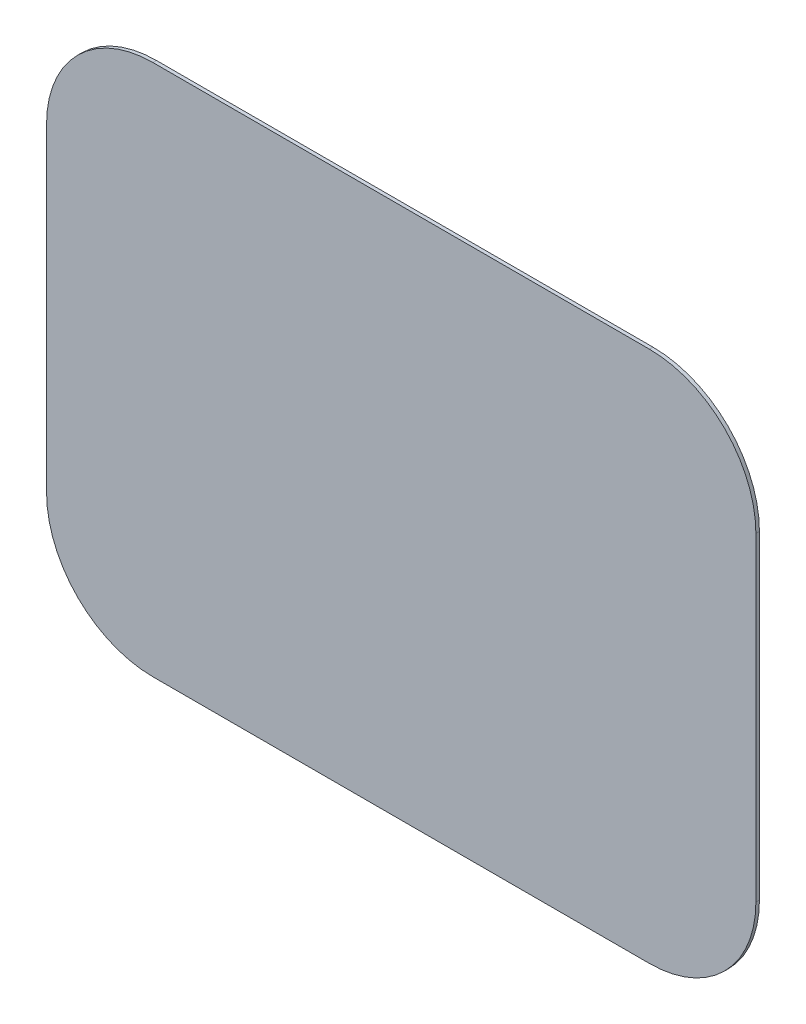
ISO-10303-21;
HEADER;
FILE_DESCRIPTION(('STEP AP214'),'2;1');
FILE_NAME('part.step','',(''),(''),'','','');
FILE_SCHEMA(('AUTOMOTIVE_DESIGN { 1 0 10303 214 1 1 1 1 }'));
ENDSEC;
DATA;
#1=APPLICATION_CONTEXT('core data for automotive mechanical design processes');
#2=APPLICATION_PROTOCOL_DEFINITION('international standard','automotive_design',2000,#1);
#3=PRODUCT_CONTEXT('',#1,'mechanical');
#4=PRODUCT('Part','Part','',(#3));
#5=PRODUCT_RELATED_PRODUCT_CATEGORY('part','',(#4));
#6=PRODUCT_DEFINITION_FORMATION('','',#4);
#7=PRODUCT_DEFINITION_CONTEXT('part definition',#1,'design');
#8=PRODUCT_DEFINITION('design','',#6,#7);
#9=PRODUCT_DEFINITION_SHAPE('','',#8);
#10=(LENGTH_UNIT() NAMED_UNIT(*) SI_UNIT(.MILLI.,.METRE.));
#11=(NAMED_UNIT(*) PLANE_ANGLE_UNIT() SI_UNIT($,.RADIAN.));
#12=(NAMED_UNIT(*) SI_UNIT($,.STERADIAN.) SOLID_ANGLE_UNIT());
#13=UNCERTAINTY_MEASURE_WITH_UNIT(LENGTH_MEASURE(1.E-05),#10,'distance_accuracy_value','');
#14=(GEOMETRIC_REPRESENTATION_CONTEXT(3) GLOBAL_UNCERTAINTY_ASSIGNED_CONTEXT((#13)) GLOBAL_UNIT_ASSIGNED_CONTEXT((#10,
#11,#12)) REPRESENTATION_CONTEXT('',''));
#15=CARTESIAN_POINT('',(0.,0.,0.));
#16=DIRECTION('',(0.,0.,1.));
#17=DIRECTION('',(1.,0.,0.));
#18=AXIS2_PLACEMENT_3D('',#15,#16,#17);
#19=CARTESIAN_POINT('',(-8.89,-5.715,0.126999999999988));
#20=DIRECTION('',(0.,0.,-1.));
#21=DIRECTION('',(-1.,0.,0.));
#22=AXIS2_PLACEMENT_3D('',#19,#20,#21);
#23=PLANE('',#22);
#24=CARTESIAN_POINT('',(8.89,-5.715,0.126999999999988));
#25=DIRECTION('',(0.,0.,-1.));
#26=DIRECTION('',(-1.,0.,0.));
#27=AXIS2_PLACEMENT_3D('',#24,#25,#26);
#28=CIRCLE('',#27,3.81);
#29=CARTESIAN_POINT('',(12.7,-5.715,0.126999999999988));
#30=VERTEX_POINT('',#29);
#31=CARTESIAN_POINT('',(8.89,-9.525,0.126999999999988));
#32=VERTEX_POINT('',#31);
#33=EDGE_CURVE('E20',#30,#32,#28,.T.);
#34=ORIENTED_EDGE('',*,*,#33,.F.);
#35=DIRECTION('',(0.,1.,0.));
#36=VECTOR('',#35,1.);
#37=CARTESIAN_POINT('',(12.7,-5.715,0.126999999999988));
#38=LINE('',#37,#36);
#39=CARTESIAN_POINT('',(12.7,5.715,0.126999999999988));
#40=VERTEX_POINT('',#39);
#41=EDGE_CURVE('E84',#30,#40,#38,.T.);
#42=ORIENTED_EDGE('',*,*,#41,.T.);
#43=CARTESIAN_POINT('',(8.89,5.715,0.126999999999988));
#44=DIRECTION('',(0.,0.,-1.));
#45=DIRECTION('',(-1.,0.,0.));
#46=AXIS2_PLACEMENT_3D('',#43,#44,#45);
#47=CIRCLE('',#46,3.81);
#48=CARTESIAN_POINT('',(8.89,9.525,0.126999999999988));
#49=VERTEX_POINT('',#48);
#50=EDGE_CURVE('E127',#49,#40,#47,.T.);
#51=ORIENTED_EDGE('',*,*,#50,.F.);
#52=DIRECTION('',(1.,0.,0.));
#53=VECTOR('',#52,1.);
#54=CARTESIAN_POINT('',(-8.89,9.525,0.126999999999988));
#55=LINE('',#54,#53);
#56=CARTESIAN_POINT('',(-8.89,9.525,0.126999999999988));
#57=VERTEX_POINT('',#56);
#58=EDGE_CURVE('E104',#49,#57,#55,.F.);
#59=ORIENTED_EDGE('',*,*,#58,.T.);
#60=CARTESIAN_POINT('',(-8.89,5.715,0.126999999999988));
#61=DIRECTION('',(0.,0.,-1.));
#62=DIRECTION('',(-1.,0.,0.));
#63=AXIS2_PLACEMENT_3D('',#60,#61,#62);
#64=CIRCLE('',#63,3.81);
#65=CARTESIAN_POINT('',(-12.7,5.715,0.126999999999988));
#66=VERTEX_POINT('',#65);
#67=EDGE_CURVE('E129',#66,#57,#64,.T.);
#68=ORIENTED_EDGE('',*,*,#67,.F.);
#69=DIRECTION('',(0.,1.,0.));
#70=VECTOR('',#69,1.);
#71=CARTESIAN_POINT('',(-12.7,-5.715,0.126999999999988));
#72=LINE('',#71,#70);
#73=CARTESIAN_POINT('',(-12.7,-5.715,0.126999999999988));
#74=VERTEX_POINT('',#73);
#75=EDGE_CURVE('E108',#66,#74,#72,.F.);
#76=ORIENTED_EDGE('',*,*,#75,.T.);
#77=CARTESIAN_POINT('',(-8.89,-5.715,0.126999999999988));
#78=DIRECTION('',(0.,0.,-1.));
#79=DIRECTION('',(-1.,0.,0.));
#80=AXIS2_PLACEMENT_3D('',#77,#78,#79);
#81=CIRCLE('',#80,3.81);
#82=CARTESIAN_POINT('',(-8.89,-9.525,0.126999999999988));
#83=VERTEX_POINT('',#82);
#84=EDGE_CURVE('E131',#83,#74,#81,.T.);
#85=ORIENTED_EDGE('',*,*,#84,.F.);
#86=DIRECTION('',(-1.,0.,0.));
#87=VECTOR('',#86,1.);
#88=CARTESIAN_POINT('',(-8.89,-9.525,0.126999999999988));
#89=LINE('',#88,#87);
#90=EDGE_CURVE('E86',#83,#32,#89,.F.);
#91=ORIENTED_EDGE('',*,*,#90,.T.);
#92=EDGE_LOOP('',(#34,#42,#51,#59,#68,#76,#85,#91));
#93=FACE_BOUND('',#92,.T.);
#94=ADVANCED_FACE('F17',(#93),#23,.F.);
#95=CARTESIAN_POINT('',(8.89,-5.715,0.126999999999988));
#96=DIRECTION('',(0.,0.,-1.));
#97=DIRECTION('',(-1.,0.,0.));
#98=AXIS2_PLACEMENT_3D('',#95,#96,#97);
#99=CYLINDRICAL_SURFACE('',#98,3.81);
#100=CARTESIAN_POINT('',(8.89,-5.715,0.));
#101=DIRECTION('',(0.,0.,-1.));
#102=DIRECTION('',(-1.,0.,0.));
#103=AXIS2_PLACEMENT_3D('',#100,#101,#102);
#104=CIRCLE('',#103,3.81);
#105=CARTESIAN_POINT('',(12.7,-5.715,0.));
#106=VERTEX_POINT('',#105);
#107=CARTESIAN_POINT('',(8.89,-9.525,0.));
#108=VERTEX_POINT('',#107);
#109=EDGE_CURVE('E93',#106,#108,#104,.T.);
#110=ORIENTED_EDGE('',*,*,#109,.F.);
#111=DIRECTION('',(0.,0.,1.));
#112=VECTOR('',#111,1.);
#113=CARTESIAN_POINT('',(12.7,-5.715,0.126999999999988));
#114=LINE('',#113,#112);
#115=EDGE_CURVE('E90',#106,#30,#114,.T.);
#116=ORIENTED_EDGE('',*,*,#115,.T.);
#117=ORIENTED_EDGE('',*,*,#33,.T.);
#118=DIRECTION('',(0.,0.,1.));
#119=VECTOR('',#118,1.);
#120=CARTESIAN_POINT('',(8.89,-9.525,0.126999999999988));
#121=LINE('',#120,#119);
#122=EDGE_CURVE('E102',#32,#108,#121,.F.);
#123=ORIENTED_EDGE('',*,*,#122,.T.);
#124=EDGE_LOOP('',(#110,#116,#117,#123));
#125=FACE_BOUND('',#124,.T.);
#126=ADVANCED_FACE('F91',(#125),#99,.T.);
#127=CARTESIAN_POINT('',(-8.89,-9.525,0.126999999999988));
#128=DIRECTION('',(0.,1.,0.));
#129=DIRECTION('',(-1.,0.,0.));
#130=AXIS2_PLACEMENT_3D('',#127,#128,#129);
#131=PLANE('',#130);
#132=ORIENTED_EDGE('',*,*,#90,.F.);
#133=DIRECTION('',(0.,0.,-1.));
#134=VECTOR('',#133,1.);
#135=CARTESIAN_POINT('',(-8.89,-9.525,0.126999999999988));
#136=LINE('',#135,#134);
#137=CARTESIAN_POINT('',(-8.89,-9.525,0.));
#138=VERTEX_POINT('',#137);
#139=EDGE_CURVE('E111',#138,#83,#136,.F.);
#140=ORIENTED_EDGE('',*,*,#139,.F.);
#141=DIRECTION('',(-1.,0.,0.));
#142=VECTOR('',#141,1.);
#143=CARTESIAN_POINT('',(-8.89,-9.525,0.));
#144=LINE('',#143,#142);
#145=EDGE_CURVE('E125',#108,#138,#144,.T.);
#146=ORIENTED_EDGE('',*,*,#145,.F.);
#147=ORIENTED_EDGE('',*,*,#122,.F.);
#148=EDGE_LOOP('',(#132,#140,#146,#147));
#149=FACE_BOUND('',#148,.T.);
#150=ADVANCED_FACE('F142',(#149),#131,.F.);
#151=CARTESIAN_POINT('',(-8.89,-5.715,0.126999999999988));
#152=DIRECTION('',(0.,0.,-1.));
#153=DIRECTION('',(-1.,0.,0.));
#154=AXIS2_PLACEMENT_3D('',#151,#152,#153);
#155=CYLINDRICAL_SURFACE('',#154,3.81);
#156=CARTESIAN_POINT('',(-8.89,-5.715,0.));
#157=DIRECTION('',(0.,0.,-1.));
#158=DIRECTION('',(-1.,0.,0.));
#159=AXIS2_PLACEMENT_3D('',#156,#157,#158);
#160=CIRCLE('',#159,3.81);
#161=CARTESIAN_POINT('',(-12.7,-5.715,0.));
#162=VERTEX_POINT('',#161);
#163=EDGE_CURVE('E121',#138,#162,#160,.T.);
#164=ORIENTED_EDGE('',*,*,#163,.F.);
#165=ORIENTED_EDGE('',*,*,#139,.T.);
#166=ORIENTED_EDGE('',*,*,#84,.T.);
#167=DIRECTION('',(0.,0.,1.));
#168=VECTOR('',#167,1.);
#169=CARTESIAN_POINT('',(-12.7,-5.715,0.126999999999988));
#170=LINE('',#169,#168);
#171=EDGE_CURVE('E110',#74,#162,#170,.F.);
#172=ORIENTED_EDGE('',*,*,#171,.T.);
#173=EDGE_LOOP('',(#164,#165,#166,#172));
#174=FACE_BOUND('',#173,.T.);
#175=ADVANCED_FACE('F160',(#174),#155,.T.);
#176=CARTESIAN_POINT('',(-12.7,-5.715,0.126999999999988));
#177=DIRECTION('',(1.,0.,0.));
#178=DIRECTION('',(0.,1.,0.));
#179=AXIS2_PLACEMENT_3D('',#176,#177,#178);
#180=PLANE('',#179);
#181=ORIENTED_EDGE('',*,*,#75,.F.);
#182=DIRECTION('',(0.,0.,-1.));
#183=VECTOR('',#182,1.);
#184=CARTESIAN_POINT('',(-12.7,5.715,0.126999999999988));
#185=LINE('',#184,#183);
#186=CARTESIAN_POINT('',(-12.7,5.715,0.));
#187=VERTEX_POINT('',#186);
#188=EDGE_CURVE('E107',#187,#66,#185,.F.);
#189=ORIENTED_EDGE('',*,*,#188,.F.);
#190=DIRECTION('',(0.,1.,0.));
#191=VECTOR('',#190,1.);
#192=CARTESIAN_POINT('',(-12.7,-5.715,0.));
#193=LINE('',#192,#191);
#194=EDGE_CURVE('E120',#162,#187,#193,.T.);
#195=ORIENTED_EDGE('',*,*,#194,.F.);
#196=ORIENTED_EDGE('',*,*,#171,.F.);
#197=EDGE_LOOP('',(#181,#189,#195,#196));
#198=FACE_BOUND('',#197,.T.);
#199=ADVANCED_FACE('F164',(#198),#180,.F.);
#200=CARTESIAN_POINT('',(-8.89,5.715,0.126999999999988));
#201=DIRECTION('',(0.,0.,-1.));
#202=DIRECTION('',(-1.,0.,0.));
#203=AXIS2_PLACEMENT_3D('',#200,#201,#202);
#204=CYLINDRICAL_SURFACE('',#203,3.81);
#205=CARTESIAN_POINT('',(-8.89,5.715,0.));
#206=DIRECTION('',(0.,0.,-1.));
#207=DIRECTION('',(-1.,0.,0.));
#208=AXIS2_PLACEMENT_3D('',#205,#206,#207);
#209=CIRCLE('',#208,3.81);
#210=CARTESIAN_POINT('',(-8.89,9.525,0.));
#211=VERTEX_POINT('',#210);
#212=EDGE_CURVE('E117',#187,#211,#209,.T.);
#213=ORIENTED_EDGE('',*,*,#212,.F.);
#214=ORIENTED_EDGE('',*,*,#188,.T.);
#215=ORIENTED_EDGE('',*,*,#67,.T.);
#216=DIRECTION('',(0.,0.,1.));
#217=VECTOR('',#216,1.);
#218=CARTESIAN_POINT('',(-8.89,9.525,0.126999999999988));
#219=LINE('',#218,#217);
#220=EDGE_CURVE('E106',#57,#211,#219,.F.);
#221=ORIENTED_EDGE('',*,*,#220,.T.);
#222=EDGE_LOOP('',(#213,#214,#215,#221));
#223=FACE_BOUND('',#222,.T.);
#224=ADVANCED_FACE('F169',(#223),#204,.T.);
#225=CARTESIAN_POINT('',(-8.89,9.525,0.126999999999988));
#226=DIRECTION('',(0.,-1.,0.));
#227=DIRECTION('',(1.,0.,0.));
#228=AXIS2_PLACEMENT_3D('',#225,#226,#227);
#229=PLANE('',#228);
#230=ORIENTED_EDGE('',*,*,#58,.F.);
#231=DIRECTION('',(0.,0.,-1.));
#232=VECTOR('',#231,1.);
#233=CARTESIAN_POINT('',(8.89,9.525,0.126999999999988));
#234=LINE('',#233,#232);
#235=CARTESIAN_POINT('',(8.89,9.525,0.));
#236=VERTEX_POINT('',#235);
#237=EDGE_CURVE('E95',#236,#49,#234,.F.);
#238=ORIENTED_EDGE('',*,*,#237,.F.);
#239=DIRECTION('',(-1.,0.,0.));
#240=VECTOR('',#239,1.);
#241=CARTESIAN_POINT('',(-8.89,9.525,0.));
#242=LINE('',#241,#240);
#243=EDGE_CURVE('E116',#211,#236,#242,.F.);
#244=ORIENTED_EDGE('',*,*,#243,.F.);
#245=ORIENTED_EDGE('',*,*,#220,.F.);
#246=EDGE_LOOP('',(#230,#238,#244,#245));
#247=FACE_BOUND('',#246,.T.);
#248=ADVANCED_FACE('F171',(#247),#229,.F.);
#249=CARTESIAN_POINT('',(8.89,5.715,0.126999999999988));
#250=DIRECTION('',(0.,0.,-1.));
#251=DIRECTION('',(-1.,0.,0.));
#252=AXIS2_PLACEMENT_3D('',#249,#250,#251);
#253=CYLINDRICAL_SURFACE('',#252,3.81);
#254=CARTESIAN_POINT('',(8.89,5.715,0.));
#255=DIRECTION('',(0.,0.,-1.));
#256=DIRECTION('',(-1.,0.,0.));
#257=AXIS2_PLACEMENT_3D('',#254,#255,#256);
#258=CIRCLE('',#257,3.81);
#259=CARTESIAN_POINT('',(12.7,5.715,0.));
#260=VERTEX_POINT('',#259);
#261=EDGE_CURVE('E26',#236,#260,#258,.T.);
#262=ORIENTED_EDGE('',*,*,#261,.F.);
#263=ORIENTED_EDGE('',*,*,#237,.T.);
#264=ORIENTED_EDGE('',*,*,#50,.T.);
#265=DIRECTION('',(0.,0.,1.));
#266=VECTOR('',#265,1.);
#267=CARTESIAN_POINT('',(12.7,5.715,0.126999999999988));
#268=LINE('',#267,#266);
#269=EDGE_CURVE('E35',#40,#260,#268,.F.);
#270=ORIENTED_EDGE('',*,*,#269,.T.);
#271=EDGE_LOOP('',(#262,#263,#264,#270));
#272=FACE_BOUND('',#271,.T.);
#273=ADVANCED_FACE('F151',(#272),#253,.T.);
#274=CARTESIAN_POINT('',(12.7,-5.715,0.126999999999988));
#275=DIRECTION('',(-1.,0.,0.));
#276=DIRECTION('',(0.,0.,1.));
#277=AXIS2_PLACEMENT_3D('',#274,#275,#276);
#278=PLANE('',#277);
#279=ORIENTED_EDGE('',*,*,#41,.F.);
#280=ORIENTED_EDGE('',*,*,#115,.F.);
#281=DIRECTION('',(0.,1.,0.));
#282=VECTOR('',#281,1.);
#283=CARTESIAN_POINT('',(12.7,-5.715,0.));
#284=LINE('',#283,#282);
#285=EDGE_CURVE('E11',#260,#106,#284,.F.);
#286=ORIENTED_EDGE('',*,*,#285,.F.);
#287=ORIENTED_EDGE('',*,*,#269,.F.);
#288=EDGE_LOOP('',(#279,#280,#286,#287));
#289=FACE_BOUND('',#288,.T.);
#290=ADVANCED_FACE('F97',(#289),#278,.F.);
#291=CARTESIAN_POINT('',(-8.89,-5.715,0.));
#292=DIRECTION('',(0.,0.,-1.));
#293=DIRECTION('',(-1.,0.,0.));
#294=AXIS2_PLACEMENT_3D('',#291,#292,#293);
#295=PLANE('',#294);
#296=ORIENTED_EDGE('',*,*,#261,.T.);
#297=ORIENTED_EDGE('',*,*,#285,.T.);
#298=ORIENTED_EDGE('',*,*,#109,.T.);
#299=ORIENTED_EDGE('',*,*,#145,.T.);
#300=ORIENTED_EDGE('',*,*,#163,.T.);
#301=ORIENTED_EDGE('',*,*,#194,.T.);
#302=ORIENTED_EDGE('',*,*,#212,.T.);
#303=ORIENTED_EDGE('',*,*,#243,.T.);
#304=EDGE_LOOP('',(#296,#297,#298,#299,#300,#301,#302,#303));
#305=FACE_BOUND('',#304,.T.);
#306=ADVANCED_FACE('F147',(#305),#295,.T.);
#307=CLOSED_SHELL('',(#94,#126,#150,#175,#199,#224,#248,#273,#290,#306));
#308=MANIFOLD_SOLID_BREP('B1',#307);
#309=ADVANCED_BREP_SHAPE_REPRESENTATION('',(#18,#308),#14);
#310=SHAPE_DEFINITION_REPRESENTATION(#9,#309);
ENDSEC;
END-ISO-10303-21;
